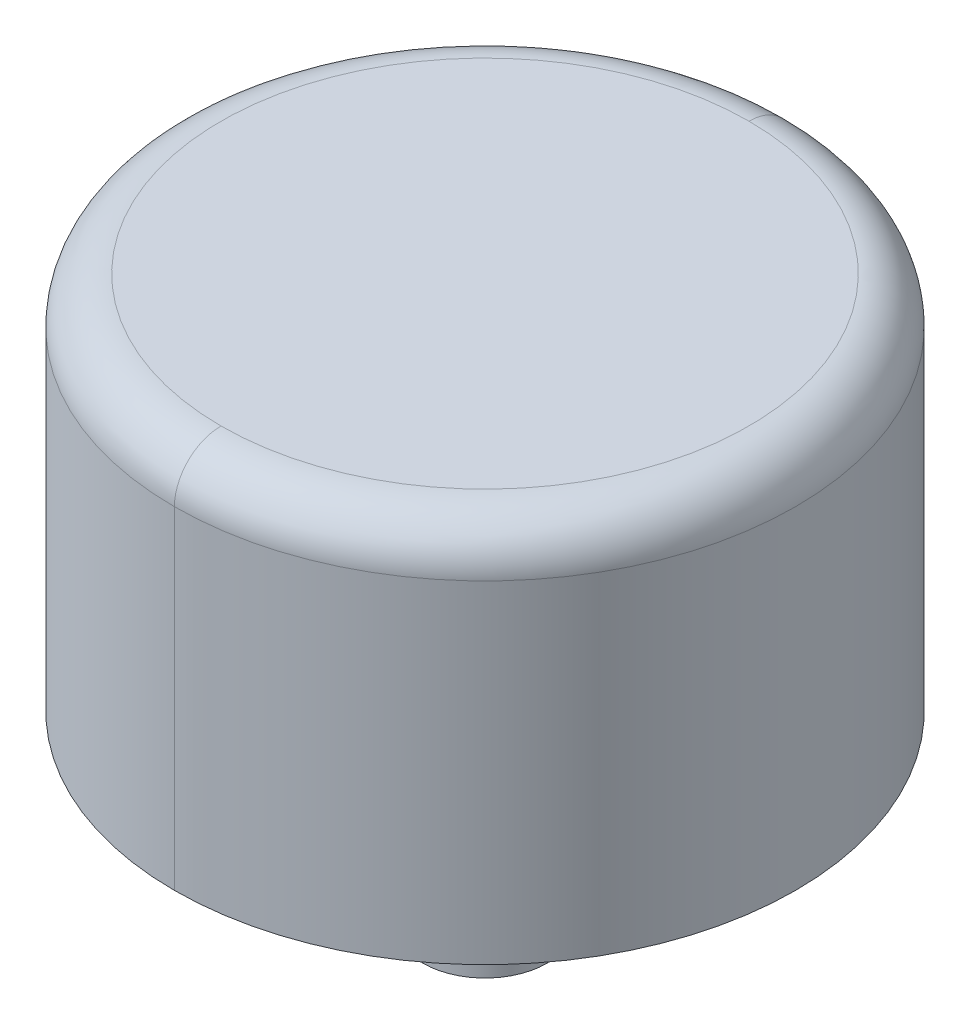
ISO-10303-21;
HEADER;
FILE_DESCRIPTION(('STEP AP214'),'2;1');
FILE_NAME('part.step','',(''),(''),'','','');
FILE_SCHEMA(('AUTOMOTIVE_DESIGN { 1 0 10303 214 1 1 1 1 }'));
ENDSEC;
DATA;
#1=APPLICATION_CONTEXT('core data for automotive mechanical design processes');
#2=APPLICATION_PROTOCOL_DEFINITION('international standard','automotive_design',2000,#1);
#3=PRODUCT_CONTEXT('',#1,'mechanical');
#4=PRODUCT('Part','Part','',(#3));
#5=PRODUCT_RELATED_PRODUCT_CATEGORY('part','',(#4));
#6=PRODUCT_DEFINITION_FORMATION('','',#4);
#7=PRODUCT_DEFINITION_CONTEXT('part definition',#1,'design');
#8=PRODUCT_DEFINITION('design','',#6,#7);
#9=PRODUCT_DEFINITION_SHAPE('','',#8);
#10=(LENGTH_UNIT() NAMED_UNIT(*) SI_UNIT(.MILLI.,.METRE.));
#11=(NAMED_UNIT(*) PLANE_ANGLE_UNIT() SI_UNIT($,.RADIAN.));
#12=(NAMED_UNIT(*) SI_UNIT($,.STERADIAN.) SOLID_ANGLE_UNIT());
#13=UNCERTAINTY_MEASURE_WITH_UNIT(LENGTH_MEASURE(1.E-05),#10,'distance_accuracy_value','');
#14=(GEOMETRIC_REPRESENTATION_CONTEXT(3) GLOBAL_UNCERTAINTY_ASSIGNED_CONTEXT((#13)) GLOBAL_UNIT_ASSIGNED_CONTEXT((#10,
#11,#12)) REPRESENTATION_CONTEXT('',''));
#15=CARTESIAN_POINT('',(0.,0.,0.));
#16=DIRECTION('',(0.,0.,1.));
#17=DIRECTION('',(1.,0.,0.));
#18=AXIS2_PLACEMENT_3D('',#15,#16,#17);
#19=CARTESIAN_POINT('',(0.,12.065,0.));
#20=DIRECTION('',(0.,1.,0.));
#21=DIRECTION('',(0.,0.,1.));
#22=AXIS2_PLACEMENT_3D('',#19,#20,#21);
#23=TOROIDAL_SURFACE('',#22,10.795,1.905);
#24=CARTESIAN_POINT('',(0.,12.065,-10.795));
#25=DIRECTION('',(1.,0.,0.));
#26=DIRECTION('',(0.,0.,-1.));
#27=AXIS2_PLACEMENT_3D('',#24,#25,#26);
#28=CIRCLE('',#27,1.905);
#29=CARTESIAN_POINT('',(0.,12.065,-12.7));
#30=VERTEX_POINT('',#29);
#31=CARTESIAN_POINT('',(0.,13.97,-10.795));
#32=VERTEX_POINT('',#31);
#33=EDGE_CURVE('E164',#30,#32,#28,.T.);
#34=ORIENTED_EDGE('',*,*,#33,.F.);
#35=CARTESIAN_POINT('',(0.,12.065,0.));
#36=DIRECTION('',(0.,-1.,0.));
#37=DIRECTION('',(0.,0.,1.));
#38=AXIS2_PLACEMENT_3D('',#35,#36,#37);
#39=CIRCLE('',#38,12.7);
#40=CARTESIAN_POINT('',(0.,12.065,12.7));
#41=VERTEX_POINT('',#40);
#42=EDGE_CURVE('E9',#41,#30,#39,.T.);
#43=ORIENTED_EDGE('',*,*,#42,.F.);
#44=CARTESIAN_POINT('',(0.,12.065,10.795));
#45=DIRECTION('',(-1.,0.,0.));
#46=DIRECTION('',(0.,0.,1.));
#47=AXIS2_PLACEMENT_3D('',#44,#45,#46);
#48=CIRCLE('',#47,1.905);
#49=CARTESIAN_POINT('',(0.,13.97,10.795));
#50=VERTEX_POINT('',#49);
#51=EDGE_CURVE('E174',#41,#50,#48,.T.);
#52=ORIENTED_EDGE('',*,*,#51,.T.);
#53=CARTESIAN_POINT('',(0.,13.97,0.));
#54=DIRECTION('',(0.,1.,0.));
#55=DIRECTION('',(0.,0.,1.));
#56=AXIS2_PLACEMENT_3D('',#53,#54,#55);
#57=CIRCLE('',#56,10.795);
#58=EDGE_CURVE('E23',#32,#50,#57,.T.);
#59=ORIENTED_EDGE('',*,*,#58,.F.);
#60=EDGE_LOOP('',(#34,#43,#52,#59));
#61=FACE_BOUND('',#60,.T.);
#62=ADVANCED_FACE('F15',(#61),#23,.T.);
#63=CARTESIAN_POINT('',(0.,13.97,0.));
#64=DIRECTION('',(0.,-1.,0.));
#65=DIRECTION('',(0.,0.,-1.));
#66=AXIS2_PLACEMENT_3D('',#63,#64,#65);
#67=CYLINDRICAL_SURFACE('',#66,12.7);
#68=DIRECTION('',(0.,-1.,0.));
#69=VECTOR('',#68,1.);
#70=CARTESIAN_POINT('',(0.,13.97,12.7));
#71=LINE('',#70,#69);
#72=CARTESIAN_POINT('',(0.,-1.524,12.7));
#73=VERTEX_POINT('',#72);
#74=EDGE_CURVE('E149',#41,#73,#71,.T.);
#75=ORIENTED_EDGE('',*,*,#74,.F.);
#76=ORIENTED_EDGE('',*,*,#42,.T.);
#77=DIRECTION('',(0.,-1.,0.));
#78=VECTOR('',#77,1.);
#79=CARTESIAN_POINT('',(0.,13.97,-12.7));
#80=LINE('',#79,#78);
#81=CARTESIAN_POINT('',(0.,-1.524,-12.7));
#82=VERTEX_POINT('',#81);
#83=EDGE_CURVE('E148',#30,#82,#80,.T.);
#84=ORIENTED_EDGE('',*,*,#83,.T.);
#85=CARTESIAN_POINT('',(0.,-1.524,0.));
#86=DIRECTION('',(0.,-1.,0.));
#87=DIRECTION('',(0.,0.,-1.));
#88=AXIS2_PLACEMENT_3D('',#85,#86,#87);
#89=CIRCLE('',#88,12.7);
#90=EDGE_CURVE('E271',#73,#82,#89,.T.);
#91=ORIENTED_EDGE('',*,*,#90,.F.);
#92=EDGE_LOOP('',(#75,#76,#84,#91));
#93=FACE_BOUND('',#92,.T.);
#94=ADVANCED_FACE('F144',(#93),#67,.T.);
#95=CARTESIAN_POINT('',(0.,13.97,0.));
#96=DIRECTION('',(0.,1.,0.));
#97=DIRECTION('',(1.,0.,0.));
#98=AXIS2_PLACEMENT_3D('',#95,#96,#97);
#99=PLANE('',#98);
#100=CARTESIAN_POINT('',(0.,13.97,0.));
#101=DIRECTION('',(0.,1.,0.));
#102=DIRECTION('',(0.,0.,1.));
#103=AXIS2_PLACEMENT_3D('',#100,#101,#102);
#104=CIRCLE('',#103,10.795);
#105=EDGE_CURVE('E168',#50,#32,#104,.T.);
#106=ORIENTED_EDGE('',*,*,#105,.T.);
#107=ORIENTED_EDGE('',*,*,#58,.T.);
#108=EDGE_LOOP('',(#106,#107));
#109=FACE_BOUND('',#108,.T.);
#110=ADVANCED_FACE('F296',(#109),#99,.T.);
#111=CARTESIAN_POINT('',(0.,-1.524,0.));
#112=DIRECTION('',(0.,1.,0.));
#113=DIRECTION('',(0.,0.,1.));
#114=AXIS2_PLACEMENT_3D('',#111,#112,#113);
#115=CYLINDRICAL_SURFACE('',#114,11.938);
#116=DIRECTION('',(0.,1.,0.));
#117=VECTOR('',#116,1.);
#118=CARTESIAN_POINT('',(0.,-1.524,-11.938));
#119=LINE('',#118,#117);
#120=CARTESIAN_POINT('',(0.,-1.524,-11.938));
#121=VERTEX_POINT('',#120);
#122=CARTESIAN_POINT('',(0.,0.,-11.938));
#123=VERTEX_POINT('',#122);
#124=EDGE_CURVE('E188',#121,#123,#119,.T.);
#125=ORIENTED_EDGE('',*,*,#124,.F.);
#126=CARTESIAN_POINT('',(0.,-1.524,0.));
#127=DIRECTION('',(0.,-1.,0.));
#128=DIRECTION('',(0.,0.,-1.));
#129=AXIS2_PLACEMENT_3D('',#126,#127,#128);
#130=CIRCLE('',#129,11.938);
#131=CARTESIAN_POINT('',(0.,-1.524,11.938));
#132=VERTEX_POINT('',#131);
#133=EDGE_CURVE('E273',#121,#132,#130,.T.);
#134=ORIENTED_EDGE('',*,*,#133,.T.);
#135=DIRECTION('',(0.,1.,0.));
#136=VECTOR('',#135,1.);
#137=CARTESIAN_POINT('',(0.,-1.524,11.938));
#138=LINE('',#137,#136);
#139=CARTESIAN_POINT('',(0.,0.,11.938));
#140=VERTEX_POINT('',#139);
#141=EDGE_CURVE('E202',#132,#140,#138,.T.);
#142=ORIENTED_EDGE('',*,*,#141,.T.);
#143=CARTESIAN_POINT('',(0.,0.,0.));
#144=DIRECTION('',(0.,-1.,0.));
#145=DIRECTION('',(0.,0.,-1.));
#146=AXIS2_PLACEMENT_3D('',#143,#144,#145);
#147=CIRCLE('',#146,11.938);
#148=EDGE_CURVE('E222',#123,#140,#147,.T.);
#149=ORIENTED_EDGE('',*,*,#148,.F.);
#150=EDGE_LOOP('',(#125,#134,#142,#149));
#151=FACE_BOUND('',#150,.T.);
#152=ADVANCED_FACE('F297',(#151),#115,.F.);
#153=CARTESIAN_POINT('',(0.,-1.524,0.));
#154=DIRECTION('',(0.,-1.,0.));
#155=DIRECTION('',(0.,0.,-1.));
#156=AXIS2_PLACEMENT_3D('',#153,#154,#155);
#157=PLANE('',#156);
#158=CARTESIAN_POINT('',(0.,-1.524,0.));
#159=DIRECTION('',(0.,-1.,0.));
#160=DIRECTION('',(0.,0.,-1.));
#161=AXIS2_PLACEMENT_3D('',#158,#159,#160);
#162=CIRCLE('',#161,11.938);
#163=EDGE_CURVE('E165',#132,#121,#162,.T.);
#164=ORIENTED_EDGE('',*,*,#163,.F.);
#165=ORIENTED_EDGE('',*,*,#133,.F.);
#166=EDGE_LOOP('',(#164,#165));
#167=FACE_BOUND('',#166,.T.);
#168=CARTESIAN_POINT('',(0.,-1.524,0.));
#169=DIRECTION('',(0.,-1.,0.));
#170=DIRECTION('',(0.,0.,-1.));
#171=AXIS2_PLACEMENT_3D('',#168,#169,#170);
#172=CIRCLE('',#171,12.7);
#173=EDGE_CURVE('E159',#82,#73,#172,.T.);
#174=ORIENTED_EDGE('',*,*,#173,.T.);
#175=ORIENTED_EDGE('',*,*,#90,.T.);
#176=EDGE_LOOP('',(#174,#175));
#177=FACE_BOUND('',#176,.T.);
#178=ADVANCED_FACE('F303',(#167,#177),#157,.T.);
#179=CARTESIAN_POINT('',(0.,-9.1821,0.));
#180=DIRECTION('',(0.,-1.,0.));
#181=DIRECTION('',(0.,0.,-1.));
#182=AXIS2_PLACEMENT_3D('',#179,#180,#181);
#183=PLANE('',#182);
#184=CARTESIAN_POINT('',(0.,-9.1821,0.));
#185=DIRECTION('',(0.,-1.,0.));
#186=DIRECTION('',(0.,0.,-1.));
#187=AXIS2_PLACEMENT_3D('',#184,#185,#186);
#188=CIRCLE('',#187,2.54);
#189=CARTESIAN_POINT('',(0.,-9.1821,2.54));
#190=VERTEX_POINT('',#189);
#191=CARTESIAN_POINT('',(0.,-9.1821,-2.54));
#192=VERTEX_POINT('',#191);
#193=EDGE_CURVE('E197',#190,#192,#188,.T.);
#194=ORIENTED_EDGE('',*,*,#193,.T.);
#195=CARTESIAN_POINT('',(0.,-9.1821,0.));
#196=DIRECTION('',(0.,-1.,0.));
#197=DIRECTION('',(0.,0.,-1.));
#198=AXIS2_PLACEMENT_3D('',#195,#196,#197);
#199=CIRCLE('',#198,2.54);
#200=EDGE_CURVE('E214',#192,#190,#199,.T.);
#201=ORIENTED_EDGE('',*,*,#200,.T.);
#202=EDGE_LOOP('',(#194,#201));
#203=FACE_BOUND('',#202,.T.);
#204=ADVANCED_FACE('F342',(#203),#183,.T.);
#205=CARTESIAN_POINT('',(0.,-9.1821,0.));
#206=DIRECTION('',(0.,1.,0.));
#207=DIRECTION('',(0.,0.,1.));
#208=AXIS2_PLACEMENT_3D('',#205,#206,#207);
#209=CYLINDRICAL_SURFACE('',#208,2.54);
#210=DIRECTION('',(0.,1.,0.));
#211=VECTOR('',#210,1.);
#212=CARTESIAN_POINT('',(0.,-9.1821,-2.54));
#213=LINE('',#212,#211);
#214=CARTESIAN_POINT('',(0.,-6.0071,-2.54));
#215=VERTEX_POINT('',#214);
#216=EDGE_CURVE('E176',#192,#215,#213,.T.);
#217=ORIENTED_EDGE('',*,*,#216,.F.);
#218=ORIENTED_EDGE('',*,*,#193,.F.);
#219=DIRECTION('',(0.,1.,0.));
#220=VECTOR('',#219,1.);
#221=CARTESIAN_POINT('',(0.,-9.1821,2.54));
#222=LINE('',#221,#220);
#223=CARTESIAN_POINT('',(0.,-6.0071,2.54));
#224=VERTEX_POINT('',#223);
#225=EDGE_CURVE('E223',#190,#224,#222,.T.);
#226=ORIENTED_EDGE('',*,*,#225,.T.);
#227=CARTESIAN_POINT('',(0.,-6.0071,0.));
#228=DIRECTION('',(0.,-1.,0.));
#229=DIRECTION('',(0.,0.,-1.));
#230=AXIS2_PLACEMENT_3D('',#227,#228,#229);
#231=CIRCLE('',#230,2.54);
#232=EDGE_CURVE('E191',#224,#215,#231,.T.);
#233=ORIENTED_EDGE('',*,*,#232,.T.);
#234=EDGE_LOOP('',(#217,#218,#226,#233));
#235=FACE_BOUND('',#234,.T.);
#236=ADVANCED_FACE('F354',(#235),#209,.T.);
#237=CARTESIAN_POINT('',(0.,-6.0071,0.));
#238=DIRECTION('',(0.,-1.,0.));
#239=DIRECTION('',(0.,0.,-1.));
#240=AXIS2_PLACEMENT_3D('',#237,#238,#239);
#241=PLANE('',#240);
#242=ORIENTED_EDGE('',*,*,#232,.F.);
#243=CARTESIAN_POINT('',(0.,-6.0071,0.));
#244=DIRECTION('',(0.,-1.,0.));
#245=DIRECTION('',(0.,0.,-1.));
#246=AXIS2_PLACEMENT_3D('',#243,#244,#245);
#247=CIRCLE('',#246,2.54);
#248=EDGE_CURVE('E228',#215,#224,#247,.T.);
#249=ORIENTED_EDGE('',*,*,#248,.F.);
#250=EDGE_LOOP('',(#242,#249));
#251=FACE_BOUND('',#250,.T.);
#252=DIRECTION('',(-0.978935696110106,0.,0.204168809766386));
#253=VECTOR('',#252,1.);
#254=CARTESIAN_POINT('',(3.90833659496923,-6.0071,4.3741785964633));
#255=LINE('',#254,#253);
#256=CARTESIAN_POINT('',(3.90833659496923,-6.0071,4.3741785964633));
#257=VERTEX_POINT('',#256);
#258=CARTESIAN_POINT('',(-1.83398148774276,-6.0071,5.57180807601538));
#259=VERTEX_POINT('',#258);
#260=EDGE_CURVE('E261',#257,#259,#255,.T.);
#261=ORIENTED_EDGE('',*,*,#260,.T.);
#262=DIRECTION('',(-0.666283223973175,0.,-0.745698776619562));
#263=VECTOR('',#262,1.);
#264=CARTESIAN_POINT('',(-1.83398148774276,-6.0071,5.57180807601538));
#265=LINE('',#264,#263);
#266=CARTESIAN_POINT('',(-5.74231808271199,-6.0071,1.19762947955208));
#267=VERTEX_POINT('',#266);
#268=EDGE_CURVE('E246',#259,#267,#265,.T.);
#269=ORIENTED_EDGE('',*,*,#268,.T.);
#270=DIRECTION('',(0.312652472136931,0.,-0.949867586385948));
#271=VECTOR('',#270,1.);
#272=CARTESIAN_POINT('',(-5.74231808271199,-6.0071,1.19762947955208));
#273=LINE('',#272,#271);
#274=CARTESIAN_POINT('',(-3.90833659496923,-6.0071,-4.3741785964633));
#275=VERTEX_POINT('',#274);
#276=EDGE_CURVE('E280',#267,#275,#273,.T.);
#277=ORIENTED_EDGE('',*,*,#276,.T.);
#278=DIRECTION('',(0.978935696110106,0.,-0.204168809766386));
#279=VECTOR('',#278,1.);
#280=CARTESIAN_POINT('',(-3.90833659496923,-6.0071,-4.3741785964633));
#281=LINE('',#280,#279);
#282=CARTESIAN_POINT('',(1.83398148774276,-6.0071,-5.57180807601538));
#283=VERTEX_POINT('',#282);
#284=EDGE_CURVE('E216',#275,#283,#281,.T.);
#285=ORIENTED_EDGE('',*,*,#284,.T.);
#286=DIRECTION('',(0.666283223973175,0.,0.745698776619562));
#287=VECTOR('',#286,1.);
#288=CARTESIAN_POINT('',(1.83398148774276,-6.0071,-5.57180807601538));
#289=LINE('',#288,#287);
#290=CARTESIAN_POINT('',(5.74231808271199,-6.0071,-1.19762947955208));
#291=VERTEX_POINT('',#290);
#292=EDGE_CURVE('E46',#283,#291,#289,.T.);
#293=ORIENTED_EDGE('',*,*,#292,.T.);
#294=DIRECTION('',(-0.312652472136931,0.,0.949867586385948));
#295=VECTOR('',#294,1.);
#296=CARTESIAN_POINT('',(5.74231808271199,-6.0071,-1.19762947955208));
#297=LINE('',#296,#295);
#298=EDGE_CURVE('E38',#291,#257,#297,.T.);
#299=ORIENTED_EDGE('',*,*,#298,.T.);
#300=EDGE_LOOP('',(#261,#269,#277,#285,#293,#299));
#301=FACE_BOUND('',#300,.T.);
#302=ADVANCED_FACE('F370',(#251,#301),#241,.T.);
#303=CARTESIAN_POINT('',(5.74231808271199,-6.0071,-1.19762947955208));
#304=DIRECTION('',(-0.949867586385948,0.,-0.312652472136931));
#305=DIRECTION('',(-0.312652472136931,0.,0.949867586385948));
#306=AXIS2_PLACEMENT_3D('',#303,#304,#305);
#307=PLANE('',#306);
#308=DIRECTION('',(-0.312652472136931,0.,0.949867586385948));
#309=VECTOR('',#308,1.);
#310=CARTESIAN_POINT('',(5.74231808271199,0.,-1.19762947955208));
#311=LINE('',#310,#309);
#312=CARTESIAN_POINT('',(5.74231808271199,0.,-1.19762947955208));
#313=VERTEX_POINT('',#312);
#314=CARTESIAN_POINT('',(3.90833659496923,0.,4.3741785964633));
#315=VERTEX_POINT('',#314);
#316=EDGE_CURVE('E237',#313,#315,#311,.T.);
#317=ORIENTED_EDGE('',*,*,#316,.T.);
#318=DIRECTION('',(0.,1.,0.));
#319=VECTOR('',#318,1.);
#320=CARTESIAN_POINT('',(3.90833659496923,-6.0071,4.3741785964633));
#321=LINE('',#320,#319);
#322=EDGE_CURVE('E248',#257,#315,#321,.T.);
#323=ORIENTED_EDGE('',*,*,#322,.F.);
#324=ORIENTED_EDGE('',*,*,#298,.F.);
#325=DIRECTION('',(0.,1.,0.));
#326=VECTOR('',#325,1.);
#327=CARTESIAN_POINT('',(5.74231808271199,-6.0071,-1.19762947955208));
#328=LINE('',#327,#326);
#329=EDGE_CURVE('E218',#291,#313,#328,.T.);
#330=ORIENTED_EDGE('',*,*,#329,.T.);
#331=EDGE_LOOP('',(#317,#323,#324,#330));
#332=FACE_BOUND('',#331,.T.);
#333=ADVANCED_FACE('F377',(#332),#307,.F.);
#334=CARTESIAN_POINT('',(1.83398148774276,-6.0071,-5.57180807601538));
#335=DIRECTION('',(-0.745698776619562,0.,0.666283223973175));
#336=DIRECTION('',(0.,1.,0.));
#337=AXIS2_PLACEMENT_3D('',#334,#335,#336);
#338=PLANE('',#337);
#339=DIRECTION('',(0.666283223973175,0.,0.745698776619562));
#340=VECTOR('',#339,1.);
#341=CARTESIAN_POINT('',(1.83398148774276,0.,-5.57180807601538));
#342=LINE('',#341,#340);
#343=CARTESIAN_POINT('',(1.83398148774276,0.,-5.57180807601538));
#344=VERTEX_POINT('',#343);
#345=EDGE_CURVE('E211',#344,#313,#342,.T.);
#346=ORIENTED_EDGE('',*,*,#345,.T.);
#347=ORIENTED_EDGE('',*,*,#329,.F.);
#348=ORIENTED_EDGE('',*,*,#292,.F.);
#349=DIRECTION('',(0.,1.,0.));
#350=VECTOR('',#349,1.);
#351=CARTESIAN_POINT('',(1.83398148774276,-6.0071,-5.57180807601538));
#352=LINE('',#351,#350);
#353=EDGE_CURVE('E219',#283,#344,#352,.T.);
#354=ORIENTED_EDGE('',*,*,#353,.T.);
#355=EDGE_LOOP('',(#346,#347,#348,#354));
#356=FACE_BOUND('',#355,.T.);
#357=ADVANCED_FACE('F391',(#356),#338,.F.);
#358=CARTESIAN_POINT('',(-3.90833659496923,-6.0071,-4.3741785964633));
#359=DIRECTION('',(0.204168809766386,0.,0.978935696110106));
#360=DIRECTION('',(0.,-1.,0.));
#361=AXIS2_PLACEMENT_3D('',#358,#359,#360);
#362=PLANE('',#361);
#363=DIRECTION('',(0.978935696110106,0.,-0.204168809766386));
#364=VECTOR('',#363,1.);
#365=CARTESIAN_POINT('',(-3.90833659496923,0.,-4.3741785964633));
#366=LINE('',#365,#364);
#367=CARTESIAN_POINT('',(-3.90833659496923,0.,-4.3741785964633));
#368=VERTEX_POINT('',#367);
#369=EDGE_CURVE('E206',#368,#344,#366,.T.);
#370=ORIENTED_EDGE('',*,*,#369,.T.);
#371=ORIENTED_EDGE('',*,*,#353,.F.);
#372=ORIENTED_EDGE('',*,*,#284,.F.);
#373=DIRECTION('',(0.,1.,0.));
#374=VECTOR('',#373,1.);
#375=CARTESIAN_POINT('',(-3.90833659496923,-6.0071,-4.3741785964633));
#376=LINE('',#375,#374);
#377=EDGE_CURVE('E269',#275,#368,#376,.T.);
#378=ORIENTED_EDGE('',*,*,#377,.T.);
#379=EDGE_LOOP('',(#370,#371,#372,#378));
#380=FACE_BOUND('',#379,.T.);
#381=ADVANCED_FACE('F401',(#380),#362,.F.);
#382=CARTESIAN_POINT('',(-5.74231808271199,-6.0071,1.19762947955208));
#383=DIRECTION('',(0.949867586385947,0.,0.312652472136931));
#384=DIRECTION('',(0.,-1.,0.));
#385=AXIS2_PLACEMENT_3D('',#382,#383,#384);
#386=PLANE('',#385);
#387=DIRECTION('',(0.312652472136931,0.,-0.949867586385948));
#388=VECTOR('',#387,1.);
#389=CARTESIAN_POINT('',(-5.74231808271199,0.,1.19762947955208));
#390=LINE('',#389,#388);
#391=CARTESIAN_POINT('',(-5.74231808271199,0.,1.19762947955208));
#392=VERTEX_POINT('',#391);
#393=EDGE_CURVE('E209',#392,#368,#390,.T.);
#394=ORIENTED_EDGE('',*,*,#393,.T.);
#395=ORIENTED_EDGE('',*,*,#377,.F.);
#396=ORIENTED_EDGE('',*,*,#276,.F.);
#397=DIRECTION('',(0.,1.,0.));
#398=VECTOR('',#397,1.);
#399=CARTESIAN_POINT('',(-5.74231808271199,-6.0071,1.19762947955208));
#400=LINE('',#399,#398);
#401=EDGE_CURVE('E247',#267,#392,#400,.T.);
#402=ORIENTED_EDGE('',*,*,#401,.T.);
#403=EDGE_LOOP('',(#394,#395,#396,#402));
#404=FACE_BOUND('',#403,.T.);
#405=ADVANCED_FACE('F415',(#404),#386,.F.);
#406=CARTESIAN_POINT('',(-1.83398148774276,-6.0071,5.57180807601538));
#407=DIRECTION('',(0.745698776619562,0.,-0.666283223973175));
#408=DIRECTION('',(0.,-1.,0.));
#409=AXIS2_PLACEMENT_3D('',#406,#407,#408);
#410=PLANE('',#409);
#411=DIRECTION('',(-0.666283223973175,0.,-0.745698776619562));
#412=VECTOR('',#411,1.);
#413=CARTESIAN_POINT('',(-1.83398148774276,0.,5.57180807601538));
#414=LINE('',#413,#412);
#415=CARTESIAN_POINT('',(-1.83398148774276,0.,5.57180807601538));
#416=VERTEX_POINT('',#415);
#417=EDGE_CURVE('E255',#416,#392,#414,.T.);
#418=ORIENTED_EDGE('',*,*,#417,.T.);
#419=ORIENTED_EDGE('',*,*,#401,.F.);
#420=ORIENTED_EDGE('',*,*,#268,.F.);
#421=DIRECTION('',(0.,1.,0.));
#422=VECTOR('',#421,1.);
#423=CARTESIAN_POINT('',(-1.83398148774276,-6.0071,5.57180807601538));
#424=LINE('',#423,#422);
#425=EDGE_CURVE('E256',#259,#416,#424,.T.);
#426=ORIENTED_EDGE('',*,*,#425,.T.);
#427=EDGE_LOOP('',(#418,#419,#420,#426));
#428=FACE_BOUND('',#427,.T.);
#429=ADVANCED_FACE('F425',(#428),#410,.F.);
#430=CARTESIAN_POINT('',(3.90833659496923,-6.0071,4.3741785964633));
#431=DIRECTION('',(-0.204168809766386,0.,-0.978935696110106));
#432=DIRECTION('',(-0.978935696110106,0.,0.204168809766386));
#433=AXIS2_PLACEMENT_3D('',#430,#431,#432);
#434=PLANE('',#433);
#435=DIRECTION('',(-0.978935696110106,0.,0.204168809766386));
#436=VECTOR('',#435,1.);
#437=CARTESIAN_POINT('',(3.90833659496923,0.,4.3741785964633));
#438=LINE('',#437,#436);
#439=EDGE_CURVE('E221',#315,#416,#438,.T.);
#440=ORIENTED_EDGE('',*,*,#439,.T.);
#441=ORIENTED_EDGE('',*,*,#425,.F.);
#442=ORIENTED_EDGE('',*,*,#260,.F.);
#443=ORIENTED_EDGE('',*,*,#322,.T.);
#444=EDGE_LOOP('',(#440,#441,#442,#443));
#445=FACE_BOUND('',#444,.T.);
#446=ADVANCED_FACE('F435',(#445),#434,.F.);
#447=CARTESIAN_POINT('',(0.,0.,0.));
#448=DIRECTION('',(0.,1.,0.));
#449=DIRECTION('',(1.,0.,0.));
#450=AXIS2_PLACEMENT_3D('',#447,#448,#449);
#451=PLANE('',#450);
#452=ORIENTED_EDGE('',*,*,#439,.F.);
#453=ORIENTED_EDGE('',*,*,#316,.F.);
#454=ORIENTED_EDGE('',*,*,#345,.F.);
#455=ORIENTED_EDGE('',*,*,#369,.F.);
#456=ORIENTED_EDGE('',*,*,#393,.F.);
#457=ORIENTED_EDGE('',*,*,#417,.F.);
#458=EDGE_LOOP('',(#452,#453,#454,#455,#456,#457));
#459=FACE_BOUND('',#458,.T.);
#460=CARTESIAN_POINT('',(0.,0.,0.));
#461=DIRECTION('',(0.,-1.,0.));
#462=DIRECTION('',(0.,0.,-1.));
#463=AXIS2_PLACEMENT_3D('',#460,#461,#462);
#464=CIRCLE('',#463,11.938);
#465=EDGE_CURVE('E203',#140,#123,#464,.T.);
#466=ORIENTED_EDGE('',*,*,#465,.T.);
#467=ORIENTED_EDGE('',*,*,#148,.T.);
#468=EDGE_LOOP('',(#466,#467));
#469=FACE_BOUND('',#468,.T.);
#470=ADVANCED_FACE('F445',(#459,#469),#451,.F.);
#471=CARTESIAN_POINT('',(0.,-9.1821,0.));
#472=DIRECTION('',(0.,1.,0.));
#473=DIRECTION('',(0.,0.,1.));
#474=AXIS2_PLACEMENT_3D('',#471,#472,#473);
#475=CYLINDRICAL_SURFACE('',#474,2.54);
#476=ORIENTED_EDGE('',*,*,#200,.F.);
#477=ORIENTED_EDGE('',*,*,#216,.T.);
#478=ORIENTED_EDGE('',*,*,#248,.T.);
#479=ORIENTED_EDGE('',*,*,#225,.F.);
#480=EDGE_LOOP('',(#476,#477,#478,#479));
#481=FACE_BOUND('',#480,.T.);
#482=ADVANCED_FACE('F452',(#481),#475,.T.);
#483=CARTESIAN_POINT('',(0.,-1.524,0.));
#484=DIRECTION('',(0.,1.,0.));
#485=DIRECTION('',(0.,0.,1.));
#486=AXIS2_PLACEMENT_3D('',#483,#484,#485);
#487=CYLINDRICAL_SURFACE('',#486,11.938);
#488=ORIENTED_EDGE('',*,*,#163,.T.);
#489=ORIENTED_EDGE('',*,*,#124,.T.);
#490=ORIENTED_EDGE('',*,*,#465,.F.);
#491=ORIENTED_EDGE('',*,*,#141,.F.);
#492=EDGE_LOOP('',(#488,#489,#490,#491));
#493=FACE_BOUND('',#492,.T.);
#494=ADVANCED_FACE('F463',(#493),#487,.F.);
#495=CARTESIAN_POINT('',(0.,13.97,0.));
#496=DIRECTION('',(0.,-1.,0.));
#497=DIRECTION('',(0.,0.,-1.));
#498=AXIS2_PLACEMENT_3D('',#495,#496,#497);
#499=CYLINDRICAL_SURFACE('',#498,12.7);
#500=CARTESIAN_POINT('',(0.,12.065,0.));
#501=DIRECTION('',(0.,-1.,0.));
#502=DIRECTION('',(0.,0.,1.));
#503=AXIS2_PLACEMENT_3D('',#500,#501,#502);
#504=CIRCLE('',#503,12.7);
#505=EDGE_CURVE('E158',#30,#41,#504,.T.);
#506=ORIENTED_EDGE('',*,*,#505,.T.);
#507=ORIENTED_EDGE('',*,*,#74,.T.);
#508=ORIENTED_EDGE('',*,*,#173,.F.);
#509=ORIENTED_EDGE('',*,*,#83,.F.);
#510=EDGE_LOOP('',(#506,#507,#508,#509));
#511=FACE_BOUND('',#510,.T.);
#512=ADVANCED_FACE('F156',(#511),#499,.T.);
#513=CARTESIAN_POINT('',(0.,12.065,0.));
#514=DIRECTION('',(0.,1.,0.));
#515=DIRECTION('',(0.,0.,1.));
#516=AXIS2_PLACEMENT_3D('',#513,#514,#515);
#517=TOROIDAL_SURFACE('',#516,10.795,1.905);
#518=ORIENTED_EDGE('',*,*,#505,.F.);
#519=ORIENTED_EDGE('',*,*,#33,.T.);
#520=ORIENTED_EDGE('',*,*,#105,.F.);
#521=ORIENTED_EDGE('',*,*,#51,.F.);
#522=EDGE_LOOP('',(#518,#519,#520,#521));
#523=FACE_BOUND('',#522,.T.);
#524=ADVANCED_FACE('F172',(#523),#517,.T.);
#525=CLOSED_SHELL('',(#62,#94,#110,#152,#178,#204,#236,#302,#333,#357,#381,#405,#429,#446,#470,
#482,#494,#512,#524));
#526=MANIFOLD_SOLID_BREP('B1',#525);
#527=ADVANCED_BREP_SHAPE_REPRESENTATION('',(#18,#526),#14);
#528=SHAPE_DEFINITION_REPRESENTATION(#9,#527);
ENDSEC;
END-ISO-10303-21;
